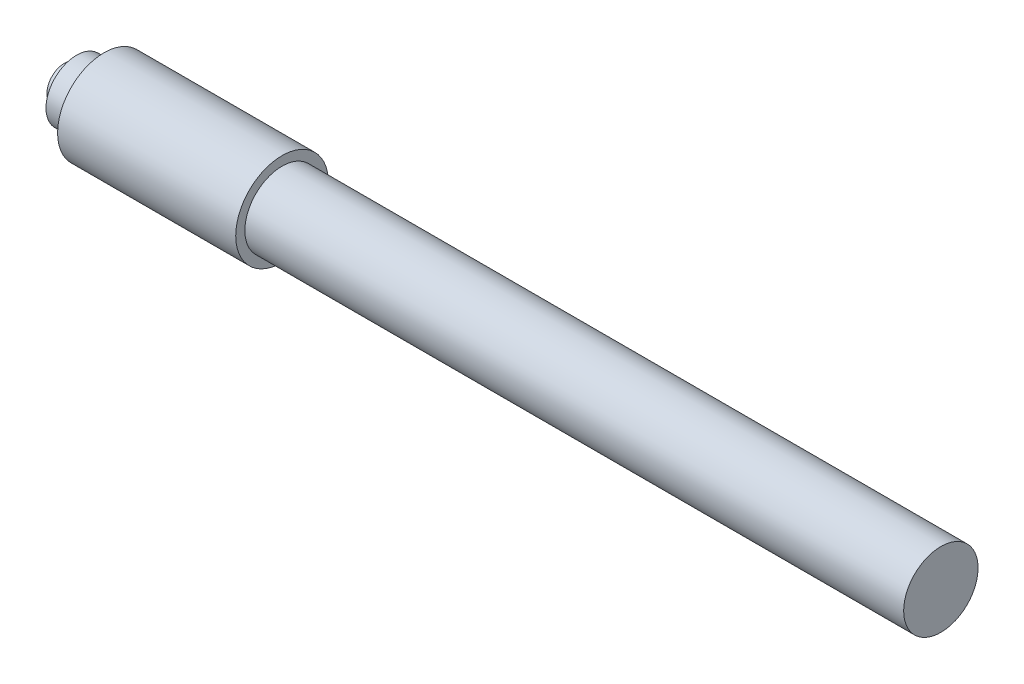
ISO-10303-21;
HEADER;
FILE_DESCRIPTION(('STEP AP214'),'2;1');
FILE_NAME('part.step','',(''),(''),'','','');
FILE_SCHEMA(('AUTOMOTIVE_DESIGN { 1 0 10303 214 1 1 1 1 }'));
ENDSEC;
DATA;
#1=APPLICATION_CONTEXT('core data for automotive mechanical design processes');
#2=APPLICATION_PROTOCOL_DEFINITION('international standard','automotive_design',2000,#1);
#3=PRODUCT_CONTEXT('',#1,'mechanical');
#4=PRODUCT('Part','Part','',(#3));
#5=PRODUCT_RELATED_PRODUCT_CATEGORY('part','',(#4));
#6=PRODUCT_DEFINITION_FORMATION('','',#4);
#7=PRODUCT_DEFINITION_CONTEXT('part definition',#1,'design');
#8=PRODUCT_DEFINITION('design','',#6,#7);
#9=PRODUCT_DEFINITION_SHAPE('','',#8);
#10=(LENGTH_UNIT() NAMED_UNIT(*) SI_UNIT(.MILLI.,.METRE.));
#11=(NAMED_UNIT(*) PLANE_ANGLE_UNIT() SI_UNIT($,.RADIAN.));
#12=(NAMED_UNIT(*) SI_UNIT($,.STERADIAN.) SOLID_ANGLE_UNIT());
#13=UNCERTAINTY_MEASURE_WITH_UNIT(LENGTH_MEASURE(1.E-05),#10,'distance_accuracy_value','');
#14=(GEOMETRIC_REPRESENTATION_CONTEXT(3) GLOBAL_UNCERTAINTY_ASSIGNED_CONTEXT((#13)) GLOBAL_UNIT_ASSIGNED_CONTEXT((#10,
#11,#12)) REPRESENTATION_CONTEXT('',''));
#15=CARTESIAN_POINT('',(0.,0.,0.));
#16=DIRECTION('',(0.,0.,1.));
#17=DIRECTION('',(1.,0.,0.));
#18=AXIS2_PLACEMENT_3D('',#15,#16,#17);
#19=CARTESIAN_POINT('',(0.,0.,0.));
#20=DIRECTION('',(1.,0.,0.));
#21=DIRECTION('',(0.,0.,-1.));
#22=AXIS2_PLACEMENT_3D('',#19,#20,#21);
#23=PLANE('',#22);
#24=CARTESIAN_POINT('',(0.,0.,0.));
#25=DIRECTION('',(-1.,0.,0.));
#26=DIRECTION('',(0.,0.,1.));
#27=AXIS2_PLACEMENT_3D('',#24,#25,#26);
#28=CIRCLE('',#27,2.85);
#29=CARTESIAN_POINT('',(0.,0.,2.85));
#30=VERTEX_POINT('',#29);
#31=EDGE_CURVE('E12',#30,#30,#28,.T.);
#32=ORIENTED_EDGE('',*,*,#31,.T.);
#33=EDGE_LOOP('',(#32));
#34=FACE_BOUND('',#33,.T.);
#35=ADVANCED_FACE('F46',(#34),#23,.F.);
#36=CARTESIAN_POINT('',(0.,0.,0.));
#37=DIRECTION('',(-1.,0.,0.));
#38=DIRECTION('',(0.,0.,1.));
#39=AXIS2_PLACEMENT_3D('',#36,#37,#38);
#40=CYLINDRICAL_SURFACE('',#39,2.85);
#41=ORIENTED_EDGE('',*,*,#31,.F.);
#42=EDGE_LOOP('',(#41));
#43=FACE_BOUND('',#42,.T.);
#44=CARTESIAN_POINT('',(2.,0.,0.));
#45=DIRECTION('',(-1.,0.,0.));
#46=DIRECTION('',(0.,0.,1.));
#47=AXIS2_PLACEMENT_3D('',#44,#45,#46);
#48=CIRCLE('',#47,2.85);
#49=CARTESIAN_POINT('',(2.,0.,2.85));
#50=VERTEX_POINT('',#49);
#51=EDGE_CURVE('E53',#50,#50,#48,.T.);
#52=ORIENTED_EDGE('',*,*,#51,.T.);
#53=EDGE_LOOP('',(#52));
#54=FACE_BOUND('',#53,.T.);
#55=ADVANCED_FACE('F101',(#43,#54),#40,.T.);
#56=CARTESIAN_POINT('',(2.,2.85,0.));
#57=DIRECTION('',(1.,0.,0.));
#58=DIRECTION('',(0.,0.,-1.));
#59=AXIS2_PLACEMENT_3D('',#56,#57,#58);
#60=PLANE('',#59);
#61=ORIENTED_EDGE('',*,*,#51,.F.);
#62=EDGE_LOOP('',(#61));
#63=FACE_BOUND('',#62,.T.);
#64=CARTESIAN_POINT('',(2.,0.,0.));
#65=DIRECTION('',(-1.,0.,0.));
#66=DIRECTION('',(0.,0.,1.));
#67=AXIS2_PLACEMENT_3D('',#64,#65,#66);
#68=CIRCLE('',#67,5.);
#69=CARTESIAN_POINT('',(2.,0.,5.));
#70=VERTEX_POINT('',#69);
#71=EDGE_CURVE('E59',#70,#70,#68,.T.);
#72=ORIENTED_EDGE('',*,*,#71,.T.);
#73=EDGE_LOOP('',(#72));
#74=FACE_BOUND('',#73,.T.);
#75=ADVANCED_FACE('F105',(#63,#74),#60,.F.);
#76=CARTESIAN_POINT('',(0.,0.,0.));
#77=DIRECTION('',(-1.,0.,0.));
#78=DIRECTION('',(0.,0.,1.));
#79=AXIS2_PLACEMENT_3D('',#76,#77,#78);
#80=CYLINDRICAL_SURFACE('',#79,5.);
#81=ORIENTED_EDGE('',*,*,#71,.F.);
#82=EDGE_LOOP('',(#81));
#83=FACE_BOUND('',#82,.T.);
#84=CARTESIAN_POINT('',(6.50000000000001,0.,0.));
#85=DIRECTION('',(-1.,0.,0.));
#86=DIRECTION('',(0.,0.,1.));
#87=AXIS2_PLACEMENT_3D('',#84,#85,#86);
#88=CIRCLE('',#87,5.);
#89=CARTESIAN_POINT('',(6.50000000000001,0.,5.));
#90=VERTEX_POINT('',#89);
#91=EDGE_CURVE('E65',#90,#90,#88,.T.);
#92=ORIENTED_EDGE('',*,*,#91,.T.);
#93=EDGE_LOOP('',(#92));
#94=FACE_BOUND('',#93,.T.);
#95=ADVANCED_FACE('F110',(#83,#94),#80,.T.);
#96=CARTESIAN_POINT('',(6.50000000000001,5.00000000000001,0.));
#97=DIRECTION('',(1.,0.,0.));
#98=DIRECTION('',(0.,0.,-1.));
#99=AXIS2_PLACEMENT_3D('',#96,#97,#98);
#100=PLANE('',#99);
#101=ORIENTED_EDGE('',*,*,#91,.F.);
#102=EDGE_LOOP('',(#101));
#103=FACE_BOUND('',#102,.T.);
#104=CARTESIAN_POINT('',(6.50000000000001,0.,0.));
#105=DIRECTION('',(-1.,0.,0.));
#106=DIRECTION('',(0.,0.,1.));
#107=AXIS2_PLACEMENT_3D('',#104,#105,#106);
#108=CIRCLE('',#107,7.6);
#109=CARTESIAN_POINT('',(6.50000000000001,0.,7.6));
#110=VERTEX_POINT('',#109);
#111=EDGE_CURVE('E71',#110,#110,#108,.T.);
#112=ORIENTED_EDGE('',*,*,#111,.T.);
#113=EDGE_LOOP('',(#112));
#114=FACE_BOUND('',#113,.T.);
#115=ADVANCED_FACE('F116',(#103,#114),#100,.F.);
#116=CARTESIAN_POINT('',(0.,0.,0.));
#117=DIRECTION('',(-1.,0.,0.));
#118=DIRECTION('',(0.,0.,1.));
#119=AXIS2_PLACEMENT_3D('',#116,#117,#118);
#120=CYLINDRICAL_SURFACE('',#119,7.6);
#121=ORIENTED_EDGE('',*,*,#111,.F.);
#122=EDGE_LOOP('',(#121));
#123=FACE_BOUND('',#122,.T.);
#124=CARTESIAN_POINT('',(35.7,0.,0.));
#125=DIRECTION('',(-1.,0.,0.));
#126=DIRECTION('',(0.,0.,1.));
#127=AXIS2_PLACEMENT_3D('',#124,#125,#126);
#128=CIRCLE('',#127,7.6);
#129=CARTESIAN_POINT('',(35.7,0.,7.6));
#130=VERTEX_POINT('',#129);
#131=EDGE_CURVE('E75',#130,#130,#128,.T.);
#132=ORIENTED_EDGE('',*,*,#131,.T.);
#133=EDGE_LOOP('',(#132));
#134=FACE_BOUND('',#133,.T.);
#135=ADVANCED_FACE('F120',(#123,#134),#120,.T.);
#136=CARTESIAN_POINT('',(35.7,7.6,0.));
#137=DIRECTION('',(-1.,0.,0.));
#138=DIRECTION('',(0.,0.,1.));
#139=AXIS2_PLACEMENT_3D('',#136,#137,#138);
#140=PLANE('',#139);
#141=ORIENTED_EDGE('',*,*,#131,.F.);
#142=EDGE_LOOP('',(#141));
#143=FACE_BOUND('',#142,.T.);
#144=CARTESIAN_POINT('',(35.7,0.,0.));
#145=DIRECTION('',(-1.,0.,0.));
#146=DIRECTION('',(0.,0.,1.));
#147=AXIS2_PLACEMENT_3D('',#144,#145,#146);
#148=CIRCLE('',#147,6.1);
#149=CARTESIAN_POINT('',(35.7,0.,6.1));
#150=VERTEX_POINT('',#149);
#151=EDGE_CURVE('E79',#150,#150,#148,.T.);
#152=ORIENTED_EDGE('',*,*,#151,.T.);
#153=EDGE_LOOP('',(#152));
#154=FACE_BOUND('',#153,.T.);
#155=ADVANCED_FACE('F97',(#143,#154),#140,.F.);
#156=CARTESIAN_POINT('',(0.,0.,0.));
#157=DIRECTION('',(-1.,0.,0.));
#158=DIRECTION('',(0.,0.,1.));
#159=AXIS2_PLACEMENT_3D('',#156,#157,#158);
#160=CYLINDRICAL_SURFACE('',#159,6.1);
#161=ORIENTED_EDGE('',*,*,#151,.F.);
#162=EDGE_LOOP('',(#161));
#163=FACE_BOUND('',#162,.T.);
#164=CARTESIAN_POINT('',(143.7,0.,0.));
#165=DIRECTION('',(-1.,0.,0.));
#166=DIRECTION('',(0.,0.,1.));
#167=AXIS2_PLACEMENT_3D('',#164,#165,#166);
#168=CIRCLE('',#167,6.1);
#169=CARTESIAN_POINT('',(143.7,0.,6.1));
#170=VERTEX_POINT('',#169);
#171=EDGE_CURVE('E83',#170,#170,#168,.T.);
#172=ORIENTED_EDGE('',*,*,#171,.T.);
#173=EDGE_LOOP('',(#172));
#174=FACE_BOUND('',#173,.T.);
#175=ADVANCED_FACE('F89',(#163,#174),#160,.T.);
#176=CARTESIAN_POINT('',(143.7,6.1,0.));
#177=DIRECTION('',(-1.,0.,0.));
#178=DIRECTION('',(0.,0.,1.));
#179=AXIS2_PLACEMENT_3D('',#176,#177,#178);
#180=PLANE('',#179);
#181=ORIENTED_EDGE('',*,*,#171,.F.);
#182=EDGE_LOOP('',(#181));
#183=FACE_BOUND('',#182,.T.);
#184=ADVANCED_FACE('F91',(#183),#180,.F.);
#185=CLOSED_SHELL('',(#35,#55,#75,#95,#115,#135,#155,#175,#184));
#186=MANIFOLD_SOLID_BREP('B2',#185);
#187=ADVANCED_BREP_SHAPE_REPRESENTATION('',(#18,#186),#14);
#188=SHAPE_DEFINITION_REPRESENTATION(#9,#187);
ENDSEC;
END-ISO-10303-21;
